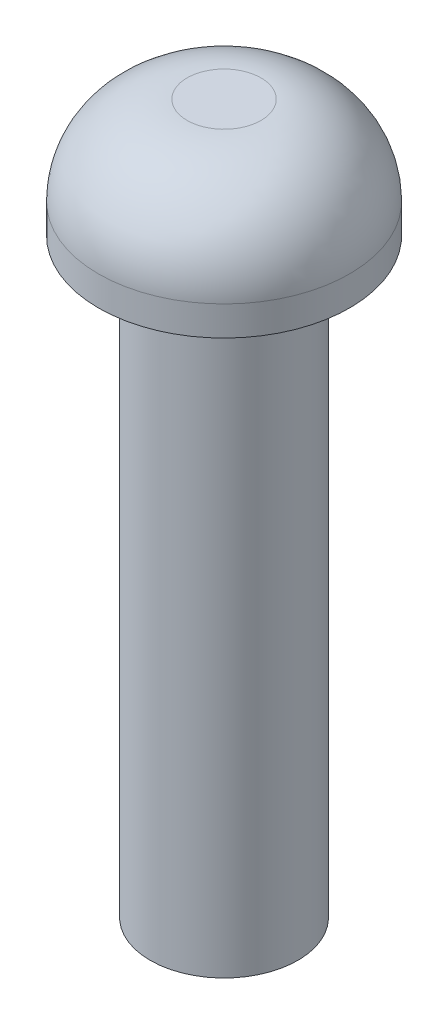
ISO-10303-21;
HEADER;
FILE_DESCRIPTION(('STEP AP214'),'2;1');
FILE_NAME('part.step','',(''),(''),'','','');
FILE_SCHEMA(('AUTOMOTIVE_DESIGN { 1 0 10303 214 1 1 1 1 }'));
ENDSEC;
DATA;
#1=APPLICATION_CONTEXT('core data for automotive mechanical design processes');
#2=APPLICATION_PROTOCOL_DEFINITION('international standard','automotive_design',2000,#1);
#3=PRODUCT_CONTEXT('',#1,'mechanical');
#4=PRODUCT('Part','Part','',(#3));
#5=PRODUCT_RELATED_PRODUCT_CATEGORY('part','',(#4));
#6=PRODUCT_DEFINITION_FORMATION('','',#4);
#7=PRODUCT_DEFINITION_CONTEXT('part definition',#1,'design');
#8=PRODUCT_DEFINITION('design','',#6,#7);
#9=PRODUCT_DEFINITION_SHAPE('','',#8);
#10=(LENGTH_UNIT() NAMED_UNIT(*) SI_UNIT(.MILLI.,.METRE.));
#11=(NAMED_UNIT(*) PLANE_ANGLE_UNIT() SI_UNIT($,.RADIAN.));
#12=(NAMED_UNIT(*) SI_UNIT($,.STERADIAN.) SOLID_ANGLE_UNIT());
#13=UNCERTAINTY_MEASURE_WITH_UNIT(LENGTH_MEASURE(1.E-05),#10,'distance_accuracy_value','');
#14=(GEOMETRIC_REPRESENTATION_CONTEXT(3) GLOBAL_UNCERTAINTY_ASSIGNED_CONTEXT((#13)) GLOBAL_UNIT_ASSIGNED_CONTEXT((#10,
#11,#12)) REPRESENTATION_CONTEXT('',''));
#15=CARTESIAN_POINT('',(0.,0.,0.));
#16=DIRECTION('',(0.,0.,1.));
#17=DIRECTION('',(1.,0.,0.));
#18=AXIS2_PLACEMENT_3D('',#15,#16,#17);
#19=CARTESIAN_POINT('',(0.,20.,0.));
#20=DIRECTION('',(0.,-1.,0.));
#21=DIRECTION('',(0.,0.,-1.));
#22=AXIS2_PLACEMENT_3D('',#19,#20,#21);
#23=CYLINDRICAL_SURFACE('',#22,2.5);
#24=CARTESIAN_POINT('',(0.,20.,0.));
#25=DIRECTION('',(0.,1.,0.));
#26=DIRECTION('',(0.,0.,1.));
#27=AXIS2_PLACEMENT_3D('',#24,#25,#26);
#28=CIRCLE('',#27,2.5);
#29=CARTESIAN_POINT('',(0.,20.,2.5));
#30=VERTEX_POINT('',#29);
#31=EDGE_CURVE('E50',#30,#30,#28,.T.);
#32=ORIENTED_EDGE('',*,*,#31,.F.);
#33=EDGE_LOOP('',(#32));
#34=FACE_BOUND('',#33,.T.);
#35=CARTESIAN_POINT('',(0.,0.,0.));
#36=DIRECTION('',(0.,1.,0.));
#37=DIRECTION('',(0.,0.,1.));
#38=AXIS2_PLACEMENT_3D('',#35,#36,#37);
#39=CIRCLE('',#38,2.5);
#40=CARTESIAN_POINT('',(0.,0.,2.5));
#41=VERTEX_POINT('',#40);
#42=EDGE_CURVE('E55',#41,#41,#39,.T.);
#43=ORIENTED_EDGE('',*,*,#42,.T.);
#44=EDGE_LOOP('',(#43));
#45=FACE_BOUND('',#44,.T.);
#46=ADVANCED_FACE('F37',(#34,#45),#23,.T.);
#47=CARTESIAN_POINT('',(0.,0.,0.));
#48=DIRECTION('',(0.,1.,0.));
#49=DIRECTION('',(0.,0.,1.));
#50=AXIS2_PLACEMENT_3D('',#47,#48,#49);
#51=PLANE('',#50);
#52=ORIENTED_EDGE('',*,*,#42,.F.);
#53=EDGE_LOOP('',(#52));
#54=FACE_BOUND('',#53,.T.);
#55=ADVANCED_FACE('F81',(#54),#51,.F.);
#56=CARTESIAN_POINT('',(0.,24.,0.));
#57=DIRECTION('',(0.,-1.,0.));
#58=DIRECTION('',(0.,0.,-1.));
#59=AXIS2_PLACEMENT_3D('',#56,#57,#58);
#60=CYLINDRICAL_SURFACE('',#59,4.25);
#61=CARTESIAN_POINT('',(0.,21.,0.));
#62=DIRECTION('',(0.,1.,0.));
#63=DIRECTION('',(0.,0.,1.));
#64=AXIS2_PLACEMENT_3D('',#61,#62,#63);
#65=CIRCLE('',#64,4.25);
#66=CARTESIAN_POINT('',(0.,21.,4.25));
#67=VERTEX_POINT('',#66);
#68=EDGE_CURVE('E10',#67,#67,#65,.F.);
#69=ORIENTED_EDGE('',*,*,#68,.T.);
#70=EDGE_LOOP('',(#69));
#71=FACE_BOUND('',#70,.T.);
#72=CARTESIAN_POINT('',(0.,20.,0.));
#73=DIRECTION('',(0.,1.,0.));
#74=DIRECTION('',(0.,0.,1.));
#75=AXIS2_PLACEMENT_3D('',#72,#73,#74);
#76=CIRCLE('',#75,4.25);
#77=CARTESIAN_POINT('',(0.,20.,4.25));
#78=VERTEX_POINT('',#77);
#79=EDGE_CURVE('E60',#78,#78,#76,.T.);
#80=ORIENTED_EDGE('',*,*,#79,.T.);
#81=EDGE_LOOP('',(#80));
#82=FACE_BOUND('',#81,.T.);
#83=ADVANCED_FACE('F66',(#71,#82),#60,.T.);
#84=CARTESIAN_POINT('',(0.,24.,0.));
#85=DIRECTION('',(0.,1.,0.));
#86=DIRECTION('',(0.,0.,1.));
#87=AXIS2_PLACEMENT_3D('',#84,#85,#86);
#88=PLANE('',#87);
#89=CARTESIAN_POINT('',(0.,24.,0.));
#90=DIRECTION('',(0.,1.,0.));
#91=DIRECTION('',(0.,0.,1.));
#92=AXIS2_PLACEMENT_3D('',#89,#90,#91);
#93=CIRCLE('',#92,1.25);
#94=CARTESIAN_POINT('',(0.,24.,1.25));
#95=VERTEX_POINT('',#94);
#96=EDGE_CURVE('E45',#95,#95,#93,.T.);
#97=ORIENTED_EDGE('',*,*,#96,.T.);
#98=EDGE_LOOP('',(#97));
#99=FACE_BOUND('',#98,.T.);
#100=ADVANCED_FACE('F70',(#99),#88,.T.);
#101=CARTESIAN_POINT('',(0.,20.,0.));
#102=DIRECTION('',(0.,1.,0.));
#103=DIRECTION('',(0.,0.,1.));
#104=AXIS2_PLACEMENT_3D('',#101,#102,#103);
#105=PLANE('',#104);
#106=ORIENTED_EDGE('',*,*,#31,.T.);
#107=EDGE_LOOP('',(#106));
#108=FACE_BOUND('',#107,.T.);
#109=ORIENTED_EDGE('',*,*,#79,.F.);
#110=EDGE_LOOP('',(#109));
#111=FACE_BOUND('',#110,.T.);
#112=ADVANCED_FACE('F68',(#108,#111),#105,.F.);
#113=CARTESIAN_POINT('',(0.,21.,0.));
#114=DIRECTION('',(0.,1.,0.));
#115=DIRECTION('',(0.,0.,1.));
#116=AXIS2_PLACEMENT_3D('',#113,#114,#115);
#117=DEGENERATE_TOROIDAL_SURFACE('',#116,1.25,3.,.T.);
#118=ORIENTED_EDGE('',*,*,#68,.F.);
#119=EDGE_LOOP('',(#118));
#120=FACE_BOUND('',#119,.T.);
#121=ORIENTED_EDGE('',*,*,#96,.F.);
#122=EDGE_LOOP('',(#121));
#123=FACE_BOUND('',#122,.T.);
#124=ADVANCED_FACE('F39',(#120,#123),#117,.T.);
#125=CLOSED_SHELL('',(#46,#55,#83,#100,#112,#124));
#126=MANIFOLD_SOLID_BREP('B2',#125);
#127=ADVANCED_BREP_SHAPE_REPRESENTATION('',(#18,#126),#14);
#128=SHAPE_DEFINITION_REPRESENTATION(#9,#127);
ENDSEC;
END-ISO-10303-21;
